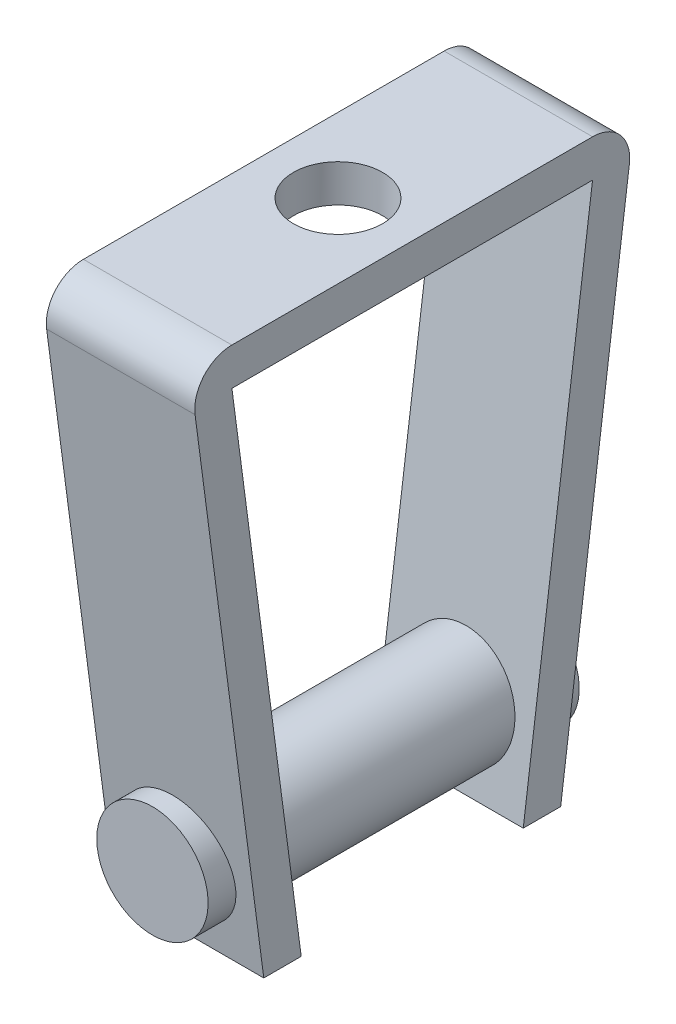
ISO-10303-21;
HEADER;
FILE_DESCRIPTION(('STEP AP214'),'2;1');
FILE_NAME('part.step','',(''),(''),'','','');
FILE_SCHEMA(('AUTOMOTIVE_DESIGN { 1 0 10303 214 1 1 1 1 }'));
ENDSEC;
DATA;
#1=APPLICATION_CONTEXT('core data for automotive mechanical design processes');
#2=APPLICATION_PROTOCOL_DEFINITION('international standard','automotive_design',2000,#1);
#3=PRODUCT_CONTEXT('',#1,'mechanical');
#4=PRODUCT('Part','Part','',(#3));
#5=PRODUCT_RELATED_PRODUCT_CATEGORY('part','',(#4));
#6=PRODUCT_DEFINITION_FORMATION('','',#4);
#7=PRODUCT_DEFINITION_CONTEXT('part definition',#1,'design');
#8=PRODUCT_DEFINITION('design','',#6,#7);
#9=PRODUCT_DEFINITION_SHAPE('','',#8);
#10=(LENGTH_UNIT() NAMED_UNIT(*) SI_UNIT(.MILLI.,.METRE.));
#11=(NAMED_UNIT(*) PLANE_ANGLE_UNIT() SI_UNIT($,.RADIAN.));
#12=(NAMED_UNIT(*) SI_UNIT($,.STERADIAN.) SOLID_ANGLE_UNIT());
#13=UNCERTAINTY_MEASURE_WITH_UNIT(LENGTH_MEASURE(1.E-05),#10,'distance_accuracy_value','');
#14=(GEOMETRIC_REPRESENTATION_CONTEXT(3) GLOBAL_UNCERTAINTY_ASSIGNED_CONTEXT((#13)) GLOBAL_UNIT_ASSIGNED_CONTEXT((#10,
#11,#12)) REPRESENTATION_CONTEXT('',''));
#15=CARTESIAN_POINT('',(0.,0.,0.));
#16=DIRECTION('',(0.,0.,1.));
#17=DIRECTION('',(1.,0.,0.));
#18=AXIS2_PLACEMENT_3D('',#15,#16,#17);
#19=CARTESIAN_POINT('',(-48.2056660012812,30.1777161561973,274.478449624226));
#20=DIRECTION('',(0.,-1.,0.));
#21=DIRECTION('',(0.,0.,-1.));
#22=AXIS2_PLACEMENT_3D('',#19,#20,#21);
#23=PLANE('',#22);
#24=DIRECTION('',(0.,0.,-1.));
#25=VECTOR('',#24,1.);
#26=CARTESIAN_POINT('',(-28.2056660012811,30.1777161561973,274.478449624226));
#27=LINE('',#26,#25);
#28=CARTESIAN_POINT('',(-28.2056660012811,30.1777161561973,279.521546439156));
#29=VERTEX_POINT('',#28);
#30=CARTESIAN_POINT('',(-28.2056660012811,30.1777161561973,274.478449624226));
#31=VERTEX_POINT('',#30);
#32=EDGE_CURVE('E177',#29,#31,#27,.T.);
#33=ORIENTED_EDGE('',*,*,#32,.F.);
#34=DIRECTION('',(1.,0.,0.));
#35=VECTOR('',#34,1.);
#36=CARTESIAN_POINT('',(-48.2056660012811,30.1777161561973,279.521546439156));
#37=LINE('',#36,#35);
#38=CARTESIAN_POINT('',(-48.2056660012811,30.1777161561973,279.521546439156));
#39=VERTEX_POINT('',#38);
#40=EDGE_CURVE('E141',#39,#29,#37,.T.);
#41=ORIENTED_EDGE('',*,*,#40,.F.);
#42=DIRECTION('',(0.,0.,-1.));
#43=VECTOR('',#42,1.);
#44=CARTESIAN_POINT('',(-48.2056660012812,30.1777161561973,274.478449624226));
#45=LINE('',#44,#43);
#46=CARTESIAN_POINT('',(-48.2056660012812,30.1777161561973,274.478449624226));
#47=VERTEX_POINT('',#46);
#48=EDGE_CURVE('E123',#39,#47,#45,.T.);
#49=ORIENTED_EDGE('',*,*,#48,.T.);
#50=DIRECTION('',(1.,0.,0.));
#51=VECTOR('',#50,1.);
#52=CARTESIAN_POINT('',(-48.2056660012812,30.1777161561973,274.478449624226));
#53=LINE('',#52,#51);
#54=EDGE_CURVE('E181',#47,#31,#53,.T.);
#55=ORIENTED_EDGE('',*,*,#54,.T.);
#56=EDGE_LOOP('',(#33,#41,#49,#55));
#57=FACE_BOUND('',#56,.T.);
#58=ADVANCED_FACE('F17',(#57),#23,.T.);
#59=CARTESIAN_POINT('',(-48.2056660012811,56.1777161561973,294.478449624226));
#60=DIRECTION('',(-1.,0.,0.));
#61=DIRECTION('',(0.,0.,1.));
#62=AXIS2_PLACEMENT_3D('',#59,#60,#61);
#63=PLANE('',#62);
#64=DIRECTION('',(0.,-0.991454295542544,-0.130454512571387));
#65=VECTOR('',#64,1.);
#66=CARTESIAN_POINT('',(-48.205666001281,106.177716156197,324.478449624226));
#67=LINE('',#66,#65);
#68=CARTESIAN_POINT('',(-48.205666001281,100.52544359334,323.734729550166));
#69=VERTEX_POINT('',#68);
#70=CARTESIAN_POINT('',(-48.205666001281,30.1777161561973,314.478449624226));
#71=VERTEX_POINT('',#70);
#72=EDGE_CURVE('E159',#69,#71,#67,.T.);
#73=ORIENTED_EDGE('',*,*,#72,.F.);
#74=CARTESIAN_POINT('',(-48.205666001281,101.177716156197,318.777458072453));
#75=DIRECTION('',(-1.,0.,0.));
#76=DIRECTION('',(0.,0.,1.));
#77=AXIS2_PLACEMENT_3D('',#74,#75,#76);
#78=CIRCLE('',#77,5.);
#79=CARTESIAN_POINT('',(-48.205666001281,106.177716156197,318.777458072453));
#80=VERTEX_POINT('',#79);
#81=EDGE_CURVE('E205',#69,#80,#78,.T.);
#82=ORIENTED_EDGE('',*,*,#81,.T.);
#83=DIRECTION('',(0.,0.,1.));
#84=VECTOR('',#83,1.);
#85=CARTESIAN_POINT('',(-48.205666001281,106.177716156197,324.478449624226));
#86=LINE('',#85,#84);
#87=CARTESIAN_POINT('',(-48.2056660012812,106.177716156197,270.179441175999));
#88=VERTEX_POINT('',#87);
#89=EDGE_CURVE('E154',#88,#80,#86,.T.);
#90=ORIENTED_EDGE('',*,*,#89,.F.);
#91=CARTESIAN_POINT('',(-48.2056660012812,101.177716156197,270.179441175999));
#92=DIRECTION('',(-1.,0.,0.));
#93=DIRECTION('',(0.,0.,1.));
#94=AXIS2_PLACEMENT_3D('',#91,#92,#93);
#95=CIRCLE('',#94,5.);
#96=CARTESIAN_POINT('',(-48.2056660012812,100.52544359334,265.222169698286));
#97=VERTEX_POINT('',#96);
#98=EDGE_CURVE('E35',#88,#97,#95,.T.);
#99=ORIENTED_EDGE('',*,*,#98,.T.);
#100=DIRECTION('',(0.,0.991454295542544,-0.130454512571387));
#101=VECTOR('',#100,1.);
#102=CARTESIAN_POINT('',(-48.2056660012812,106.177716156197,264.478449624226));
#103=LINE('',#102,#101);
#104=EDGE_CURVE('E151',#47,#97,#103,.T.);
#105=ORIENTED_EDGE('',*,*,#104,.F.);
#106=ORIENTED_EDGE('',*,*,#48,.F.);
#107=DIRECTION('',(0.,-0.991454295542544,0.130454512571388));
#108=VECTOR('',#107,1.);
#109=CARTESIAN_POINT('',(-48.2056660012811,53.8007171057119,276.413256840536));
#110=LINE('',#109,#108);
#111=CARTESIAN_POINT('',(-48.2056660012812,101.121074624639,270.186894009098));
#112=VERTEX_POINT('',#111);
#113=EDGE_CURVE('E112',#112,#39,#110,.T.);
#114=ORIENTED_EDGE('',*,*,#113,.F.);
#115=DIRECTION('',(0.,0.,-1.));
#116=VECTOR('',#115,1.);
#117=CARTESIAN_POINT('',(-48.2056660012811,101.121074624639,294.478449624226));
#118=LINE('',#117,#116);
#119=CARTESIAN_POINT('',(-48.205666001281,101.121074624639,318.770005239353));
#120=VERTEX_POINT('',#119);
#121=EDGE_CURVE('E100',#120,#112,#118,.T.);
#122=ORIENTED_EDGE('',*,*,#121,.F.);
#123=DIRECTION('',(0.,-0.991454295542544,-0.130454512571387));
#124=VECTOR('',#123,1.);
#125=CARTESIAN_POINT('',(-48.205666001281,53.8007171057119,312.543642407915));
#126=LINE('',#125,#124);
#127=CARTESIAN_POINT('',(-48.205666001281,30.1777161561973,309.435352809295));
#128=VERTEX_POINT('',#127);
#129=EDGE_CURVE('E111',#120,#128,#126,.T.);
#130=ORIENTED_EDGE('',*,*,#129,.T.);
#131=EDGE_CURVE('E162',#71,#128,#45,.T.);
#132=ORIENTED_EDGE('',*,*,#131,.F.);
#133=EDGE_LOOP('',(#73,#82,#90,#99,#105,#106,#114,#122,#130,#132));
#134=FACE_BOUND('',#133,.T.);
#135=ADVANCED_FACE('F122',(#134),#63,.T.);
#136=CARTESIAN_POINT('',(-28.2056660012811,56.1777161561973,294.478449624226));
#137=DIRECTION('',(-1.,0.,0.));
#138=DIRECTION('',(0.,0.,1.));
#139=AXIS2_PLACEMENT_3D('',#136,#137,#138);
#140=PLANE('',#139);
#141=DIRECTION('',(0.,0.,1.));
#142=VECTOR('',#141,1.);
#143=CARTESIAN_POINT('',(-28.205666001281,106.177716156197,324.478449624226));
#144=LINE('',#143,#142);
#145=CARTESIAN_POINT('',(-28.2056660012812,106.177716156197,270.179441175998));
#146=VERTEX_POINT('',#145);
#147=CARTESIAN_POINT('',(-28.205666001281,106.177716156197,318.777458072453));
#148=VERTEX_POINT('',#147);
#149=EDGE_CURVE('E170',#146,#148,#144,.T.);
#150=ORIENTED_EDGE('',*,*,#149,.T.);
#151=CARTESIAN_POINT('',(-28.205666001281,101.177716156197,318.777458072453));
#152=DIRECTION('',(-1.,0.,0.));
#153=DIRECTION('',(0.,0.,1.));
#154=AXIS2_PLACEMENT_3D('',#151,#152,#153);
#155=CIRCLE('',#154,5.);
#156=CARTESIAN_POINT('',(-28.205666001281,100.52544359334,323.734729550165));
#157=VERTEX_POINT('',#156);
#158=EDGE_CURVE('E198',#148,#157,#155,.F.);
#159=ORIENTED_EDGE('',*,*,#158,.T.);
#160=DIRECTION('',(0.,-0.991454295542544,-0.130454512571387));
#161=VECTOR('',#160,1.);
#162=CARTESIAN_POINT('',(-28.205666001281,106.177716156197,324.478449624226));
#163=LINE('',#162,#161);
#164=CARTESIAN_POINT('',(-28.205666001281,30.1777161561973,314.478449624226));
#165=VERTEX_POINT('',#164);
#166=EDGE_CURVE('E174',#157,#165,#163,.T.);
#167=ORIENTED_EDGE('',*,*,#166,.T.);
#168=CARTESIAN_POINT('',(-28.205666001281,30.1777161561973,309.435352809295));
#169=VERTEX_POINT('',#168);
#170=EDGE_CURVE('E155',#165,#169,#27,.T.);
#171=ORIENTED_EDGE('',*,*,#170,.T.);
#172=DIRECTION('',(0.,-0.991454295542544,-0.130454512571387));
#173=VECTOR('',#172,1.);
#174=CARTESIAN_POINT('',(-28.205666001281,53.8007171057119,312.543642407915));
#175=LINE('',#174,#173);
#176=CARTESIAN_POINT('',(-28.205666001281,101.121074624639,318.770005239353));
#177=VERTEX_POINT('',#176);
#178=EDGE_CURVE('E125',#177,#169,#175,.T.);
#179=ORIENTED_EDGE('',*,*,#178,.F.);
#180=DIRECTION('',(0.,0.,-1.));
#181=VECTOR('',#180,1.);
#182=CARTESIAN_POINT('',(-28.2056660012811,101.121074624639,294.478449624226));
#183=LINE('',#182,#181);
#184=CARTESIAN_POINT('',(-28.2056660012812,101.121074624639,270.186894009098));
#185=VERTEX_POINT('',#184);
#186=EDGE_CURVE('E129',#177,#185,#183,.T.);
#187=ORIENTED_EDGE('',*,*,#186,.T.);
#188=DIRECTION('',(0.,-0.991454295542544,0.130454512571388));
#189=VECTOR('',#188,1.);
#190=CARTESIAN_POINT('',(-28.2056660012811,53.8007171057119,276.413256840536));
#191=LINE('',#190,#189);
#192=EDGE_CURVE('E118',#185,#29,#191,.T.);
#193=ORIENTED_EDGE('',*,*,#192,.T.);
#194=ORIENTED_EDGE('',*,*,#32,.T.);
#195=DIRECTION('',(0.,0.991454295542544,-0.130454512571387));
#196=VECTOR('',#195,1.);
#197=CARTESIAN_POINT('',(-28.2056660012812,106.177716156197,264.478449624226));
#198=LINE('',#197,#196);
#199=CARTESIAN_POINT('',(-28.2056660012812,100.52544359334,265.222169698286));
#200=VERTEX_POINT('',#199);
#201=EDGE_CURVE('E144',#31,#200,#198,.T.);
#202=ORIENTED_EDGE('',*,*,#201,.T.);
#203=CARTESIAN_POINT('',(-28.2056660012812,101.177716156197,270.179441175998));
#204=DIRECTION('',(-1.,0.,0.));
#205=DIRECTION('',(0.,0.,1.));
#206=AXIS2_PLACEMENT_3D('',#203,#204,#205);
#207=CIRCLE('',#206,5.);
#208=EDGE_CURVE('E195',#200,#146,#207,.F.);
#209=ORIENTED_EDGE('',*,*,#208,.T.);
#210=EDGE_LOOP('',(#150,#159,#167,#171,#179,#187,#193,#194,#202,#209));
#211=FACE_BOUND('',#210,.T.);
#212=ADVANCED_FACE('F266',(#211),#140,.F.);
#213=CARTESIAN_POINT('',(-48.2056660012812,106.177716156197,264.478449624226));
#214=DIRECTION('',(0.,-0.130454512571387,-0.991454295542544));
#215=DIRECTION('',(0.,0.991454295542544,-0.130454512571387));
#216=AXIS2_PLACEMENT_3D('',#213,#214,#215);
#217=PLANE('',#216);
#218=CARTESIAN_POINT('',(-38.2056660012812,40.1777161561973,273.162660150541));
#219=DIRECTION('',(0.,-0.130454512571387,-0.991454295542544));
#220=DIRECTION('',(0.,0.991454295542544,-0.130454512571387));
#221=AXIS2_PLACEMENT_3D('',#218,#219,#220);
#222=ELLIPSE('',#221,7.5646452223961,7.5);
#223=CARTESIAN_POINT('',(-38.2056660012812,47.6777161561973,272.175818045278));
#224=VERTEX_POINT('',#223);
#225=EDGE_CURVE('E11',#224,#224,#222,.T.);
#226=ORIENTED_EDGE('',*,*,#225,.F.);
#227=EDGE_LOOP('',(#226));
#228=FACE_BOUND('',#227,.T.);
#229=ORIENTED_EDGE('',*,*,#104,.T.);
#230=DIRECTION('',(1.,0.,0.));
#231=VECTOR('',#230,1.);
#232=CARTESIAN_POINT('',(-48.2056660012812,100.52544359334,265.222169698286));
#233=LINE('',#232,#231);
#234=EDGE_CURVE('E208',#97,#200,#233,.T.);
#235=ORIENTED_EDGE('',*,*,#234,.T.);
#236=ORIENTED_EDGE('',*,*,#201,.F.);
#237=ORIENTED_EDGE('',*,*,#54,.F.);
#238=EDGE_LOOP('',(#229,#235,#236,#237));
#239=FACE_BOUND('',#238,.T.);
#240=ADVANCED_FACE('F264',(#228,#239),#217,.T.);
#241=DIRECTION('',(1.,0.,0.));
#242=VECTOR('',#241,1.);
#243=CARTESIAN_POINT('',(-48.205666001281,30.1777161561973,309.435352809295));
#244=LINE('',#243,#242);
#245=EDGE_CURVE('E145',#128,#169,#244,.T.);
#246=ORIENTED_EDGE('',*,*,#245,.T.);
#247=ORIENTED_EDGE('',*,*,#170,.F.);
#248=DIRECTION('',(1.,0.,0.));
#249=VECTOR('',#248,1.);
#250=CARTESIAN_POINT('',(-48.205666001281,30.1777161561973,314.478449624226));
#251=LINE('',#250,#249);
#252=EDGE_CURVE('E166',#71,#165,#251,.T.);
#253=ORIENTED_EDGE('',*,*,#252,.F.);
#254=ORIENTED_EDGE('',*,*,#131,.T.);
#255=EDGE_LOOP('',(#246,#247,#253,#254));
#256=FACE_BOUND('',#255,.T.);
#257=ADVANCED_FACE('F247',(#256),#23,.T.);
#258=CARTESIAN_POINT('',(-48.205666001281,106.177716156197,324.478449624226));
#259=DIRECTION('',(0.,-0.130454512571387,0.991454295542544));
#260=DIRECTION('',(0.,-0.991454295542544,-0.130454512571387));
#261=AXIS2_PLACEMENT_3D('',#258,#259,#260);
#262=PLANE('',#261);
#263=CARTESIAN_POINT('',(-38.205666001281,40.1777161561973,315.79423909791));
#264=DIRECTION('',(0.,-0.130454512571387,0.991454295542544));
#265=DIRECTION('',(0.,-0.991454295542544,-0.130454512571387));
#266=AXIS2_PLACEMENT_3D('',#263,#264,#265);
#267=ELLIPSE('',#266,7.5646452223961,7.5);
#268=CARTESIAN_POINT('',(-38.205666001281,32.6777161561973,314.807396992647));
#269=VERTEX_POINT('',#268);
#270=EDGE_CURVE('E27',#269,#269,#267,.T.);
#271=ORIENTED_EDGE('',*,*,#270,.F.);
#272=EDGE_LOOP('',(#271));
#273=FACE_BOUND('',#272,.T.);
#274=ORIENTED_EDGE('',*,*,#166,.F.);
#275=DIRECTION('',(1.,0.,0.));
#276=VECTOR('',#275,1.);
#277=CARTESIAN_POINT('',(-48.205666001281,100.52544359334,323.734729550166));
#278=LINE('',#277,#276);
#279=EDGE_CURVE('E43',#157,#69,#278,.F.);
#280=ORIENTED_EDGE('',*,*,#279,.T.);
#281=ORIENTED_EDGE('',*,*,#72,.T.);
#282=ORIENTED_EDGE('',*,*,#252,.T.);
#283=EDGE_LOOP('',(#274,#280,#281,#282));
#284=FACE_BOUND('',#283,.T.);
#285=ADVANCED_FACE('F244',(#273,#284),#262,.T.);
#286=CARTESIAN_POINT('',(-48.205666001281,106.177716156197,324.478449624226));
#287=DIRECTION('',(0.,1.,0.));
#288=DIRECTION('',(0.,0.,1.));
#289=AXIS2_PLACEMENT_3D('',#286,#287,#288);
#290=PLANE('',#289);
#291=CARTESIAN_POINT('',(-38.2056660012811,106.177716156197,294.478449624226));
#292=DIRECTION('',(0.,1.,0.));
#293=DIRECTION('',(0.,0.,1.));
#294=AXIS2_PLACEMENT_3D('',#291,#292,#293);
#295=CIRCLE('',#294,6.);
#296=CARTESIAN_POINT('',(-38.2056660012811,106.177716156197,300.478449624226));
#297=VERTEX_POINT('',#296);
#298=EDGE_CURVE('E132',#297,#297,#295,.T.);
#299=ORIENTED_EDGE('',*,*,#298,.F.);
#300=EDGE_LOOP('',(#299));
#301=FACE_BOUND('',#300,.T.);
#302=ORIENTED_EDGE('',*,*,#89,.T.);
#303=DIRECTION('',(1.,0.,0.));
#304=VECTOR('',#303,1.);
#305=CARTESIAN_POINT('',(-48.205666001281,106.177716156197,318.777458072453));
#306=LINE('',#305,#304);
#307=EDGE_CURVE('E191',#80,#148,#306,.T.);
#308=ORIENTED_EDGE('',*,*,#307,.T.);
#309=ORIENTED_EDGE('',*,*,#149,.F.);
#310=DIRECTION('',(1.,0.,0.));
#311=VECTOR('',#310,1.);
#312=CARTESIAN_POINT('',(-48.2056660012812,106.177716156197,270.179441175999));
#313=LINE('',#312,#311);
#314=EDGE_CURVE('E185',#146,#88,#313,.F.);
#315=ORIENTED_EDGE('',*,*,#314,.T.);
#316=EDGE_LOOP('',(#302,#308,#309,#315));
#317=FACE_BOUND('',#316,.T.);
#318=ADVANCED_FACE('F246',(#301,#317),#290,.T.);
#319=CARTESIAN_POINT('',(-48.2056660012811,53.8007171057119,276.413256840536));
#320=DIRECTION('',(0.,0.130454512571388,0.991454295542544));
#321=DIRECTION('',(0.,-0.991454295542544,0.130454512571388));
#322=AXIS2_PLACEMENT_3D('',#319,#320,#321);
#323=PLANE('',#322);
#324=CARTESIAN_POINT('',(-38.2056660012811,40.1777161561973,278.205756965472));
#325=DIRECTION('',(0.,0.130454512571388,0.991454295542544));
#326=DIRECTION('',(0.,0.991454295542544,-0.130454512571388));
#327=AXIS2_PLACEMENT_3D('',#324,#325,#326);
#328=ELLIPSE('',#327,7.5646452223961,7.5);
#329=CARTESIAN_POINT('',(-38.2056660012811,47.6777161561973,277.218914860209));
#330=VERTEX_POINT('',#329);
#331=EDGE_CURVE('E211',#330,#330,#328,.T.);
#332=ORIENTED_EDGE('',*,*,#331,.F.);
#333=EDGE_LOOP('',(#332));
#334=FACE_BOUND('',#333,.T.);
#335=ORIENTED_EDGE('',*,*,#192,.F.);
#336=DIRECTION('',(1.,0.,0.));
#337=VECTOR('',#336,1.);
#338=CARTESIAN_POINT('',(-48.2056660012812,101.121074624639,270.186894009098));
#339=LINE('',#338,#337);
#340=EDGE_CURVE('E104',#112,#185,#339,.T.);
#341=ORIENTED_EDGE('',*,*,#340,.F.);
#342=ORIENTED_EDGE('',*,*,#113,.T.);
#343=ORIENTED_EDGE('',*,*,#40,.T.);
#344=EDGE_LOOP('',(#335,#341,#342,#343));
#345=FACE_BOUND('',#344,.T.);
#346=ADVANCED_FACE('F115',(#334,#345),#323,.T.);
#347=CARTESIAN_POINT('',(-48.205666001281,53.8007171057119,312.543642407915));
#348=DIRECTION('',(0.,-0.130454512571387,0.991454295542544));
#349=DIRECTION('',(0.,-0.991454295542544,-0.130454512571387));
#350=AXIS2_PLACEMENT_3D('',#347,#348,#349);
#351=PLANE('',#350);
#352=CARTESIAN_POINT('',(-38.205666001281,40.1777161561973,310.751142282979));
#353=DIRECTION('',(0.,-0.130454512571387,0.991454295542544));
#354=DIRECTION('',(0.,-0.991454295542544,-0.130454512571387));
#355=AXIS2_PLACEMENT_3D('',#352,#353,#354);
#356=ELLIPSE('',#355,7.5646452223961,7.5);
#357=CARTESIAN_POINT('',(-38.205666001281,32.6777161561973,309.764300177716));
#358=VERTEX_POINT('',#357);
#359=EDGE_CURVE('E21',#358,#358,#356,.T.);
#360=ORIENTED_EDGE('',*,*,#359,.T.);
#361=EDGE_LOOP('',(#360));
#362=FACE_BOUND('',#361,.T.);
#363=ORIENTED_EDGE('',*,*,#178,.T.);
#364=ORIENTED_EDGE('',*,*,#245,.F.);
#365=ORIENTED_EDGE('',*,*,#129,.F.);
#366=DIRECTION('',(1.,0.,0.));
#367=VECTOR('',#366,1.);
#368=CARTESIAN_POINT('',(-48.205666001281,101.121074624639,318.770005239353));
#369=LINE('',#368,#367);
#370=EDGE_CURVE('E106',#120,#177,#369,.T.);
#371=ORIENTED_EDGE('',*,*,#370,.T.);
#372=EDGE_LOOP('',(#363,#364,#365,#371));
#373=FACE_BOUND('',#372,.T.);
#374=ADVANCED_FACE('F290',(#362,#373),#351,.F.);
#375=CARTESIAN_POINT('',(-48.2056660012811,101.121074624639,294.478449624226));
#376=DIRECTION('',(0.,-1.,0.));
#377=DIRECTION('',(-1.,0.,0.));
#378=AXIS2_PLACEMENT_3D('',#375,#376,#377);
#379=PLANE('',#378);
#380=CARTESIAN_POINT('',(-38.2056660012811,101.121074624639,294.478449624226));
#381=DIRECTION('',(0.,-1.,0.));
#382=DIRECTION('',(-1.,0.,0.));
#383=AXIS2_PLACEMENT_3D('',#380,#381,#382);
#384=CIRCLE('',#383,6.);
#385=CARTESIAN_POINT('',(-44.2056660012811,101.121074624639,294.478449624226));
#386=VERTEX_POINT('',#385);
#387=EDGE_CURVE('E138',#386,#386,#384,.T.);
#388=ORIENTED_EDGE('',*,*,#387,.F.);
#389=EDGE_LOOP('',(#388));
#390=FACE_BOUND('',#389,.T.);
#391=ORIENTED_EDGE('',*,*,#186,.F.);
#392=ORIENTED_EDGE('',*,*,#370,.F.);
#393=ORIENTED_EDGE('',*,*,#121,.T.);
#394=ORIENTED_EDGE('',*,*,#340,.T.);
#395=EDGE_LOOP('',(#391,#392,#393,#394));
#396=FACE_BOUND('',#395,.T.);
#397=ADVANCED_FACE('F103',(#390,#396),#379,.T.);
#398=CARTESIAN_POINT('',(-48.205666001281,101.177716156197,318.777458072453));
#399=DIRECTION('',(1.,0.,0.));
#400=DIRECTION('',(0.,0.,-1.));
#401=AXIS2_PLACEMENT_3D('',#398,#399,#400);
#402=CYLINDRICAL_SURFACE('',#401,5.);
#403=ORIENTED_EDGE('',*,*,#81,.F.);
#404=ORIENTED_EDGE('',*,*,#279,.F.);
#405=ORIENTED_EDGE('',*,*,#158,.F.);
#406=ORIENTED_EDGE('',*,*,#307,.F.);
#407=EDGE_LOOP('',(#403,#404,#405,#406));
#408=FACE_BOUND('',#407,.T.);
#409=ADVANCED_FACE('F254',(#408),#402,.T.);
#410=CARTESIAN_POINT('',(-48.2056660012812,101.177716156197,270.179441175999));
#411=DIRECTION('',(1.,0.,0.));
#412=DIRECTION('',(0.,0.,-1.));
#413=AXIS2_PLACEMENT_3D('',#410,#411,#412);
#414=CYLINDRICAL_SURFACE('',#413,5.);
#415=ORIENTED_EDGE('',*,*,#98,.F.);
#416=ORIENTED_EDGE('',*,*,#314,.F.);
#417=ORIENTED_EDGE('',*,*,#208,.F.);
#418=ORIENTED_EDGE('',*,*,#234,.F.);
#419=EDGE_LOOP('',(#415,#416,#417,#418));
#420=FACE_BOUND('',#419,.T.);
#421=ADVANCED_FACE('F19',(#420),#414,.T.);
#422=CARTESIAN_POINT('',(-38.2056660012811,30.1777161561973,294.478449624226));
#423=DIRECTION('',(0.,1.,0.));
#424=DIRECTION('',(0.,0.,1.));
#425=AXIS2_PLACEMENT_3D('',#422,#423,#424);
#426=CYLINDRICAL_SURFACE('',#425,6.);
#427=ORIENTED_EDGE('',*,*,#387,.T.);
#428=EDGE_LOOP('',(#427));
#429=FACE_BOUND('',#428,.T.);
#430=ORIENTED_EDGE('',*,*,#298,.T.);
#431=EDGE_LOOP('',(#430));
#432=FACE_BOUND('',#431,.T.);
#433=ADVANCED_FACE('F302',(#429,#432),#426,.F.);
#434=CARTESIAN_POINT('',(-38.205666001281,40.1777161561973,319.478449624226));
#435=DIRECTION('',(0.,0.,-1.));
#436=DIRECTION('',(-1.,0.,0.));
#437=AXIS2_PLACEMENT_3D('',#434,#435,#436);
#438=CYLINDRICAL_SURFACE('',#437,7.5);
#439=ORIENTED_EDGE('',*,*,#331,.T.);
#440=EDGE_LOOP('',(#439));
#441=FACE_BOUND('',#440,.T.);
#442=ORIENTED_EDGE('',*,*,#359,.F.);
#443=EDGE_LOOP('',(#442));
#444=FACE_BOUND('',#443,.T.);
#445=ADVANCED_FACE('F387',(#441,#444),#438,.T.);
#446=CARTESIAN_POINT('',(-38.205666001281,40.1777161561973,319.478449624226));
#447=DIRECTION('',(0.,0.,-1.));
#448=DIRECTION('',(-1.,0.,0.));
#449=AXIS2_PLACEMENT_3D('',#446,#447,#448);
#450=PLANE('',#449);
#451=CARTESIAN_POINT('',(-38.205666001281,40.1777161561973,319.478449624226));
#452=DIRECTION('',(0.,0.,-1.));
#453=DIRECTION('',(-1.,0.,0.));
#454=AXIS2_PLACEMENT_3D('',#451,#452,#453);
#455=CIRCLE('',#454,7.5);
#456=CARTESIAN_POINT('',(-45.705666001281,40.1777161561973,319.478449624226));
#457=VERTEX_POINT('',#456);
#458=EDGE_CURVE('E222',#457,#457,#455,.T.);
#459=ORIENTED_EDGE('',*,*,#458,.F.);
#460=EDGE_LOOP('',(#459));
#461=FACE_BOUND('',#460,.T.);
#462=ADVANCED_FACE('F396',(#461),#450,.F.);
#463=ORIENTED_EDGE('',*,*,#270,.T.);
#464=EDGE_LOOP('',(#463));
#465=FACE_BOUND('',#464,.T.);
#466=ORIENTED_EDGE('',*,*,#458,.T.);
#467=EDGE_LOOP('',(#466));
#468=FACE_BOUND('',#467,.T.);
#469=ADVANCED_FACE('F242',(#465,#468),#438,.T.);
#470=ORIENTED_EDGE('',*,*,#225,.T.);
#471=EDGE_LOOP('',(#470));
#472=FACE_BOUND('',#471,.T.);
#473=CARTESIAN_POINT('',(-38.2056660012812,40.1777161561973,269.478449624226));
#474=DIRECTION('',(0.,0.,-1.));
#475=DIRECTION('',(-1.,0.,0.));
#476=AXIS2_PLACEMENT_3D('',#473,#474,#475);
#477=CIRCLE('',#476,7.5);
#478=CARTESIAN_POINT('',(-45.7056660012812,40.1777161561973,269.478449624226));
#479=VERTEX_POINT('',#478);
#480=EDGE_CURVE('E227',#479,#479,#477,.T.);
#481=ORIENTED_EDGE('',*,*,#480,.F.);
#482=EDGE_LOOP('',(#481));
#483=FACE_BOUND('',#482,.T.);
#484=ADVANCED_FACE('F398',(#472,#483),#438,.T.);
#485=CARTESIAN_POINT('',(-38.2056660012812,40.1777161561973,269.478449624226));
#486=DIRECTION('',(0.,0.,-1.));
#487=DIRECTION('',(-1.,0.,0.));
#488=AXIS2_PLACEMENT_3D('',#485,#486,#487);
#489=PLANE('',#488);
#490=ORIENTED_EDGE('',*,*,#480,.T.);
#491=EDGE_LOOP('',(#490));
#492=FACE_BOUND('',#491,.T.);
#493=ADVANCED_FACE('F425',(#492),#489,.T.);
#494=CLOSED_SHELL('',(#58,#135,#212,#240,#257,#285,#318,#346,#374,#397,#409,#421,#433,#445,#462,
#469,#484,#493));
#495=MANIFOLD_SOLID_BREP('B1',#494);
#496=ADVANCED_BREP_SHAPE_REPRESENTATION('',(#18,#495),#14);
#497=SHAPE_DEFINITION_REPRESENTATION(#9,#496);
ENDSEC;
END-ISO-10303-21;
